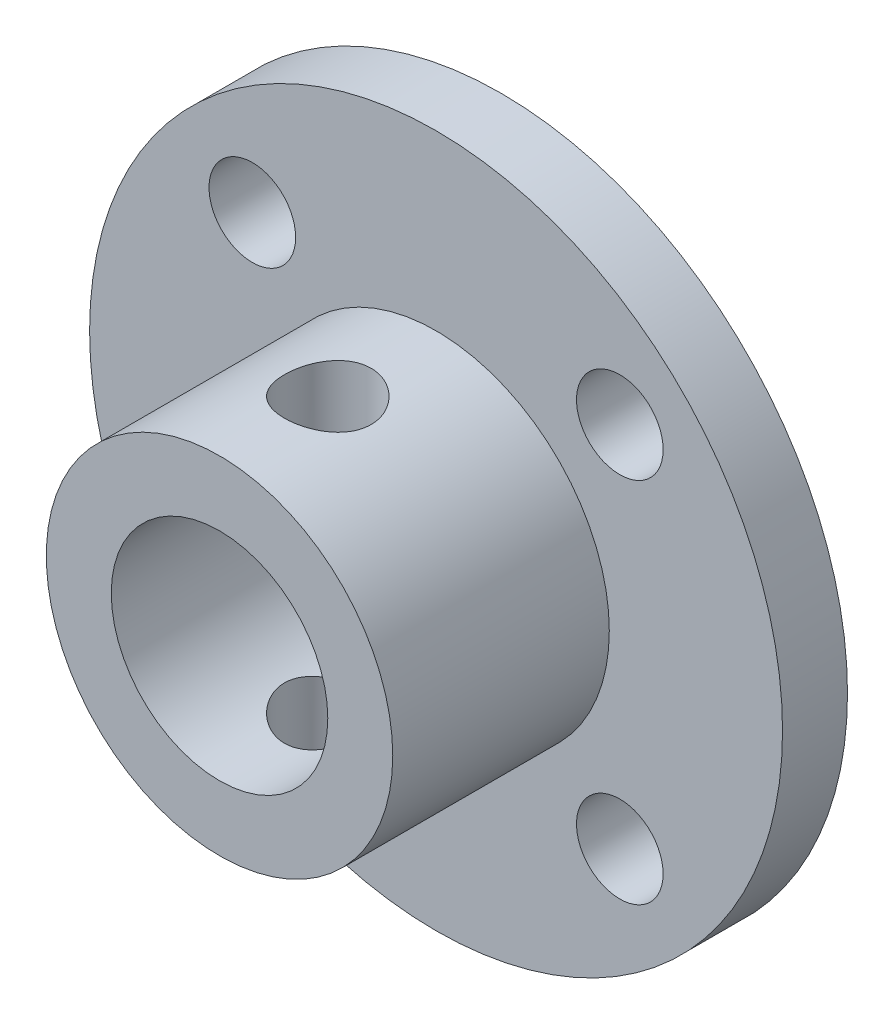
ISO-10303-21;
HEADER;
FILE_DESCRIPTION(('STEP AP214'),'2;1');
FILE_NAME('part.step','',(''),(''),'','','');
FILE_SCHEMA(('AUTOMOTIVE_DESIGN { 1 0 10303 214 1 1 1 1 }'));
ENDSEC;
DATA;
#1=APPLICATION_CONTEXT('core data for automotive mechanical design processes');
#2=APPLICATION_PROTOCOL_DEFINITION('international standard','automotive_design',2000,#1);
#3=PRODUCT_CONTEXT('',#1,'mechanical');
#4=PRODUCT('Part','Part','',(#3));
#5=PRODUCT_RELATED_PRODUCT_CATEGORY('part','',(#4));
#6=PRODUCT_DEFINITION_FORMATION('','',#4);
#7=PRODUCT_DEFINITION_CONTEXT('part definition',#1,'design');
#8=PRODUCT_DEFINITION('design','',#6,#7);
#9=PRODUCT_DEFINITION_SHAPE('','',#8);
#10=(LENGTH_UNIT() NAMED_UNIT(*) SI_UNIT(.MILLI.,.METRE.));
#11=(NAMED_UNIT(*) PLANE_ANGLE_UNIT() SI_UNIT($,.RADIAN.));
#12=(NAMED_UNIT(*) SI_UNIT($,.STERADIAN.) SOLID_ANGLE_UNIT());
#13=UNCERTAINTY_MEASURE_WITH_UNIT(LENGTH_MEASURE(1.E-05),#10,'distance_accuracy_value','');
#14=(GEOMETRIC_REPRESENTATION_CONTEXT(3) GLOBAL_UNCERTAINTY_ASSIGNED_CONTEXT((#13)) GLOBAL_UNIT_ASSIGNED_CONTEXT((#10,
#11,#12)) REPRESENTATION_CONTEXT('',''));
#15=CARTESIAN_POINT('',(0.,0.,0.));
#16=DIRECTION('',(0.,0.,1.));
#17=DIRECTION('',(1.,0.,0.));
#18=AXIS2_PLACEMENT_3D('',#15,#16,#17);
#19=CARTESIAN_POINT('',(0.,0.,3.));
#20=DIRECTION('',(0.,0.,-1.));
#21=DIRECTION('',(-1.,0.,0.));
#22=AXIS2_PLACEMENT_3D('',#19,#20,#21);
#23=CYLINDRICAL_SURFACE('',#22,5.);
#24=CARTESIAN_POINT('',(0.,-5.,6.));
#25=CARTESIAN_POINT('',(0.107493005442892,-4.99999271227084,6.00000985182372));
#26=CARTESIAN_POINT('',(0.215172564090674,-4.99649294306932,6.00871775208838));
#27=CARTESIAN_POINT('',(0.427496480417897,-4.98283453100641,6.04324770352124));
#28=CARTESIAN_POINT('',(0.532131777561249,-4.97265778698877,6.06911627908613));
#29=CARTESIAN_POINT('',(0.734953922727404,-4.94674209213118,6.13687607805883));
#30=CARTESIAN_POINT('',(0.83316066161696,-4.93102136364072,6.17871484621673));
#31=CARTESIAN_POINT('',(1.02107197032837,-4.89556610796078,6.27701917332655));
#32=CARTESIAN_POINT('',(1.11077947675099,-4.87583297458056,6.33347965491893));
#33=CARTESIAN_POINT('',(1.28350100757039,-4.83330886170418,6.46223549856094));
#34=CARTESIAN_POINT('',(1.36606227255021,-4.8104229692919,6.53510665624026));
#35=CARTESIAN_POINT('',(1.51817500478472,-4.76460576906194,6.69340000347678));
#36=CARTESIAN_POINT('',(1.58772010713353,-4.74167444453792,6.77882829721174));
#37=CARTESIAN_POINT('',(1.71487456729288,-4.69722791797136,6.96442807024227));
#38=CARTESIAN_POINT('',(1.77181498119547,-4.67582115964951,7.0650864860232));
#39=CARTESIAN_POINT('',(1.86775471903715,-4.63833647186792,7.27553639842004));
#40=CARTESIAN_POINT('',(1.90676256428584,-4.62225601244175,7.38532352784836));
#41=CARTESIAN_POINT('',(1.96389882339587,-4.59826357660818,7.6057123335921));
#42=CARTESIAN_POINT('',(1.98289396580565,-4.59001420355605,7.71605123557621));
#43=CARTESIAN_POINT('',(2.00217296164003,-4.58164004049144,7.93863499830727));
#44=CARTESIAN_POINT('',(2.00246601631322,-4.58151125522768,8.05087889462501));
#45=CARTESIAN_POINT('',(1.98498936750454,-4.58910500279994,8.26575667145804));
#46=CARTESIAN_POINT('',(1.96847531430514,-4.5962817503845,8.36851571440903));
#47=CARTESIAN_POINT('',(1.91994688029782,-4.61676187607836,8.56965955600671));
#48=CARTESIAN_POINT('',(1.88792979480463,-4.63006632321673,8.66804358811031));
#49=CARTESIAN_POINT('',(1.80869473255107,-4.6615948508853,8.86001783619604));
#50=CARTESIAN_POINT('',(1.76117986231532,-4.67991379280787,8.95346923905469));
#51=CARTESIAN_POINT('',(1.65250646073221,-4.7193811638989,9.13141581636157));
#52=CARTESIAN_POINT('',(1.59134280510084,-4.74053065456848,9.21590760940281));
#53=CARTESIAN_POINT('',(1.45155059945443,-4.7852673674227,9.380409728802));
#54=CARTESIAN_POINT('',(1.37193746297064,-4.80891664976151,9.45956872944602));
#55=CARTESIAN_POINT('',(1.20031442743019,-4.85459824958282,9.60368447800204));
#56=CARTESIAN_POINT('',(1.10830206533443,-4.87663024445324,9.66863839741029));
#57=CARTESIAN_POINT('',(0.912077652605844,-4.91714681264548,9.78361744741583));
#58=CARTESIAN_POINT('',(0.807660491346478,-4.93555270095414,9.83332228119705));
#59=CARTESIAN_POINT('',(0.591023765482883,-4.96614828328758,9.91416786107806));
#60=CARTESIAN_POINT('',(0.478808196849676,-4.97834113462382,9.94531803755741));
#61=CARTESIAN_POINT('',(0.256895887607822,-4.9945613950691,9.9864482954197));
#62=CARTESIAN_POINT('',(0.147443293985536,-4.99902945833514,9.99757245425356));
#63=CARTESIAN_POINT('',(-0.0718453098078155,-5.00068478510631,10.0017131005286));
#64=CARTESIAN_POINT('',(-0.181681213223922,-4.99787393582291,9.99473428154751));
#65=CARTESIAN_POINT('',(-0.393432739121986,-4.98557567063753,9.96370824744801));
#66=CARTESIAN_POINT('',(-0.495482491775473,-4.97639391345523,9.94044201964902));
#67=CARTESIAN_POINT('',(-0.694135428060779,-4.952594414055,9.87856429169019));
#68=CARTESIAN_POINT('',(-0.790737910224843,-4.9379759735653,9.83995082033132));
#69=CARTESIAN_POINT('',(-0.9790787858167,-4.90416594770811,9.74721506032005));
#70=CARTESIAN_POINT('',(-1.0705780227554,-4.88484815979803,9.69265452795685));
#71=CARTESIAN_POINT('',(-1.24344359124655,-4.84373364745524,9.57005967609436));
#72=CARTESIAN_POINT('',(-1.32480584076112,-4.8219359311027,9.50201995707739));
#73=CARTESIAN_POINT('',(-1.48072304302882,-4.77645117638111,9.34912998705038));
#74=CARTESIAN_POINT('',(-1.55447393380606,-4.75273441425052,9.26346645849379));
#75=CARTESIAN_POINT('',(-1.68675119741371,-4.70741672917132,9.08055991699064));
#76=CARTESIAN_POINT('',(-1.74527506133751,-4.68581615526511,8.98331499966005));
#77=CARTESIAN_POINT('',(-1.84580750193163,-4.64714299907708,8.7785383054059));
#78=CARTESIAN_POINT('',(-1.88765059453445,-4.63011630884788,8.67091600078769));
#79=CARTESIAN_POINT('',(-1.9522962197053,-4.60323673477931,8.44926634828485));
#80=CARTESIAN_POINT('',(-1.97511280526931,-4.59337855695998,8.33524379418758));
#81=CARTESIAN_POINT('',(-1.9997156172784,-4.58271759299926,8.11287209822546));
#82=CARTESIAN_POINT('',(-2.00289708230287,-4.58131421008171,8.00470516040665));
#83=CARTESIAN_POINT('',(-1.99180315927752,-4.58614836033098,7.78945514228671));
#84=CARTESIAN_POINT('',(-1.97752998791378,-4.59238492324793,7.68237192609742));
#85=CARTESIAN_POINT('',(-1.93307136615365,-4.6112664907902,7.47666781014496));
#86=CARTESIAN_POINT('',(-1.90353749357098,-4.62364831827449,7.377879725567));
#87=CARTESIAN_POINT('',(-1.83000544849101,-4.65324001232696,7.18662137038652));
#88=CARTESIAN_POINT('',(-1.78600328139381,-4.67045121206006,7.09415285310017));
#89=CARTESIAN_POINT('',(-1.68187276275973,-4.70898609604491,6.91239038072922));
#90=CARTESIAN_POINT('',(-1.62096533515949,-4.73048882313242,6.82358132986952));
#91=CARTESIAN_POINT('',(-1.4858921192715,-4.77463804372237,6.65700668279625));
#92=CARTESIAN_POINT('',(-1.41172233481812,-4.79728488048406,6.57924442787169));
#93=CARTESIAN_POINT('',(-1.24650550627246,-4.84293567087394,6.43179714673639));
#94=CARTESIAN_POINT('',(-1.15467600114614,-4.86586757962185,6.36296269310193));
#95=CARTESIAN_POINT('',(-0.959900320285779,-4.90800406713717,6.24166295737836));
#96=CARTESIAN_POINT('',(-0.856949004547238,-4.92720691092906,6.18920528784747));
#97=CARTESIAN_POINT('',(-0.644738062495204,-4.95939714815861,6.10337778480971));
#98=CARTESIAN_POINT('',(-0.535631618219697,-4.97249363055028,6.06967067643966));
#99=CARTESIAN_POINT('',(-0.312876546281222,-4.99144306209365,6.02136087904573));
#100=CARTESIAN_POINT('',(-0.199243525858914,-4.99731899495637,6.0066975632561));
#101=CARTESIAN_POINT('',(-0.0569122978909297,-4.99975899504136,6.00060461902173));
#102=CARTESIAN_POINT('',(-0.0284626887407579,-5.00000192969175,5.99999739137081));
#103=CARTESIAN_POINT('',(0.,-5.,6.));
#104=B_SPLINE_CURVE_WITH_KNOTS('',3,(#24,#25,#26,#27,#28,#29,#30,#31,#32,#33,#34,#35,#36,#37,
#38,#39,#40,#41,#42,#43,#44,#45,#46,#47,#48,#49,#50,#51,#52,#53,#54,#55,#56,#57,#58,#59,#60,#61,
#62,#63,#64,#65,#66,#67,#68,#69,#70,#71,#72,#73,#74,#75,#76,#77,#78,#79,#80,#81,#82,#83,#84,#85,
#86,#87,#88,#89,#90,#91,#92,#93,#94,#95,#96,#97,#98,#99,#100,#101,#102,#103),.UNSPECIFIED.,.T.,
.F.,(4,2,2,2,2,2,2,2,2,2,2,2,2,2,2,2,2,2,2,2,2,2,2,2,2,2,2,2,2,2,2,2,2,2,2,2,2,2,2,4),(0.,
0.322402987893071,0.645683636007934,0.967911457471581,1.29002753567984,1.62597381700397,
1.96208394934411,2.31315258819217,2.66405423118268,2.99904105308828,3.33386306340488,
3.64538328401372,3.95695787256047,4.27489126298816,4.59294421938183,4.93558349186557,
5.27829092839732,5.62776913162806,5.9770695611379,6.30569184528007,6.63422893570082,
6.94800455564365,7.26182048993796,7.58523513398262,7.90877959498969,8.25368474624413,
8.59864669043748,8.94695045140827,9.29499672645933,9.61799673392747,9.94095572563045,
10.2511431854877,10.5614163580516,10.8894546805669,11.2175920134839,11.5670042353384,
11.9165786364053,12.2596430101332,12.6016125240434,12.686980458968),.UNSPECIFIED.);
#105=CARTESIAN_POINT('',(0.,-5.,6.));
#106=VERTEX_POINT('',#105);
#107=EDGE_CURVE('E75',#106,#106,#104,.T.);
#108=ORIENTED_EDGE('',*,*,#107,.T.);
#109=EDGE_LOOP('',(#108));
#110=FACE_BOUND('',#109,.T.);
#111=CARTESIAN_POINT('',(0.,0.,0.));
#112=DIRECTION('',(0.,0.,1.));
#113=DIRECTION('',(1.,0.,0.));
#114=AXIS2_PLACEMENT_3D('',#111,#112,#113);
#115=CIRCLE('',#114,5.);
#116=CARTESIAN_POINT('',(5.,0.,0.));
#117=VERTEX_POINT('',#116);
#118=EDGE_CURVE('E51',#117,#117,#115,.T.);
#119=ORIENTED_EDGE('',*,*,#118,.F.);
#120=EDGE_LOOP('',(#119));
#121=FACE_BOUND('',#120,.T.);
#122=CARTESIAN_POINT('',(0.,0.,13.));
#123=DIRECTION('',(0.,0.,1.));
#124=DIRECTION('',(1.,0.,0.));
#125=AXIS2_PLACEMENT_3D('',#122,#123,#124);
#126=CIRCLE('',#125,5.);
#127=CARTESIAN_POINT('',(5.,0.,13.));
#128=VERTEX_POINT('',#127);
#129=EDGE_CURVE('E155',#128,#128,#126,.T.);
#130=ORIENTED_EDGE('',*,*,#129,.T.);
#131=EDGE_LOOP('',(#130));
#132=FACE_BOUND('',#131,.T.);
#133=CARTESIAN_POINT('',(0.,5.,6.));
#134=CARTESIAN_POINT('',(-0.10749300544289,4.99999271227084,6.00000985182372));
#135=CARTESIAN_POINT('',(-0.215172564090672,4.99649294306932,6.00871775208838));
#136=CARTESIAN_POINT('',(-0.427496480417895,4.98283453100641,6.04324770352124));
#137=CARTESIAN_POINT('',(-0.532131777561247,4.97265778698877,6.06911627908613));
#138=CARTESIAN_POINT('',(-0.734953922727402,4.94674209213118,6.13687607805883));
#139=CARTESIAN_POINT('',(-0.833160661616958,4.93102136364072,6.17871484621673));
#140=CARTESIAN_POINT('',(-1.02107197032837,4.89556610796078,6.27701917332655));
#141=CARTESIAN_POINT('',(-1.11077947675099,4.87583297458057,6.33347965491893));
#142=CARTESIAN_POINT('',(-1.28350100757039,4.83330886170419,6.46223549856094));
#143=CARTESIAN_POINT('',(-1.36606227255021,4.8104229692919,6.53510665624026));
#144=CARTESIAN_POINT('',(-1.51817500478472,4.76460576906194,6.69340000347678));
#145=CARTESIAN_POINT('',(-1.58772010713353,4.74167444453792,6.77882829721174));
#146=CARTESIAN_POINT('',(-1.71487456729288,4.69722791797136,6.96442807024227));
#147=CARTESIAN_POINT('',(-1.77181498119547,4.67582115964951,7.0650864860232));
#148=CARTESIAN_POINT('',(-1.86775471903715,4.63833647186792,7.27553639842004));
#149=CARTESIAN_POINT('',(-1.90676256428583,4.62225601244176,7.38532352784836));
#150=CARTESIAN_POINT('',(-1.96389882339587,4.59826357660818,7.6057123335921));
#151=CARTESIAN_POINT('',(-1.98289396580565,4.59001420355605,7.71605123557621));
#152=CARTESIAN_POINT('',(-2.00217296164003,4.58164004049144,7.93863499830727));
#153=CARTESIAN_POINT('',(-2.00246601631322,4.58151125522768,8.05087889462501));
#154=CARTESIAN_POINT('',(-1.98498936750454,4.58910500279994,8.26575667145804));
#155=CARTESIAN_POINT('',(-1.96847531430514,4.5962817503845,8.36851571440903));
#156=CARTESIAN_POINT('',(-1.91994688029782,4.61676187607836,8.56965955600671));
#157=CARTESIAN_POINT('',(-1.88792979480463,4.63006632321673,8.66804358811031));
#158=CARTESIAN_POINT('',(-1.80869473255107,4.6615948508853,8.86001783619604));
#159=CARTESIAN_POINT('',(-1.76117986231532,4.67991379280787,8.95346923905469));
#160=CARTESIAN_POINT('',(-1.65250646073221,4.7193811638989,9.13141581636157));
#161=CARTESIAN_POINT('',(-1.59134280510084,4.74053065456848,9.21590760940281));
#162=CARTESIAN_POINT('',(-1.45155059945443,4.7852673674227,9.380409728802));
#163=CARTESIAN_POINT('',(-1.37193746297063,4.80891664976151,9.45956872944602));
#164=CARTESIAN_POINT('',(-1.20031442743019,4.85459824958282,9.60368447800204));
#165=CARTESIAN_POINT('',(-1.10830206533443,4.87663024445324,9.66863839741029));
#166=CARTESIAN_POINT('',(-0.912077652605842,4.91714681264548,9.78361744741583));
#167=CARTESIAN_POINT('',(-0.807660491346477,4.93555270095414,9.83332228119705));
#168=CARTESIAN_POINT('',(-0.591023765482882,4.96614828328759,9.91416786107806));
#169=CARTESIAN_POINT('',(-0.478808196849674,4.97834113462382,9.94531803755741));
#170=CARTESIAN_POINT('',(-0.25689588760782,4.9945613950691,9.9864482954197));
#171=CARTESIAN_POINT('',(-0.147443293985535,4.99902945833514,9.99757245425356));
#172=CARTESIAN_POINT('',(0.0718453098078173,5.00068478510631,10.0017131005286));
#173=CARTESIAN_POINT('',(0.181681213223924,4.99787393582291,9.99473428154751));
#174=CARTESIAN_POINT('',(0.393432739121988,4.98557567063753,9.96370824744801));
#175=CARTESIAN_POINT('',(0.495482491775476,4.97639391345523,9.94044201964902));
#176=CARTESIAN_POINT('',(0.694135428060782,4.952594414055,9.87856429169019));
#177=CARTESIAN_POINT('',(0.790737910224846,4.9379759735653,9.83995082033132));
#178=CARTESIAN_POINT('',(0.979078785816703,4.90416594770811,9.74721506032005));
#179=CARTESIAN_POINT('',(1.07057802275541,4.88484815979803,9.69265452795685));
#180=CARTESIAN_POINT('',(1.24344359124656,4.84373364745524,9.57005967609436));
#181=CARTESIAN_POINT('',(1.32480584076113,4.8219359311027,9.50201995707739));
#182=CARTESIAN_POINT('',(1.48072304302882,4.77645117638112,9.34912998705038));
#183=CARTESIAN_POINT('',(1.55447393380606,4.75273441425052,9.26346645849379));
#184=CARTESIAN_POINT('',(1.68675119741371,4.70741672917132,9.08055991699064));
#185=CARTESIAN_POINT('',(1.74527506133751,4.6858161552651,8.98331499966005));
#186=CARTESIAN_POINT('',(1.84580750193163,4.64714299907708,8.7785383054059));
#187=CARTESIAN_POINT('',(1.88765059453445,4.63011630884787,8.67091600078769));
#188=CARTESIAN_POINT('',(1.9522962197053,4.60323673477931,8.44926634828485));
#189=CARTESIAN_POINT('',(1.97511280526932,4.59337855695998,8.33524379418758));
#190=CARTESIAN_POINT('',(1.9997156172784,4.58271759299926,8.11287209822546));
#191=CARTESIAN_POINT('',(2.00289708230287,4.58131421008171,8.00470516040665));
#192=CARTESIAN_POINT('',(1.99180315927753,4.58614836033098,7.78945514228671));
#193=CARTESIAN_POINT('',(1.97752998791378,4.59238492324793,7.68237192609742));
#194=CARTESIAN_POINT('',(1.93307136615365,4.6112664907902,7.47666781014496));
#195=CARTESIAN_POINT('',(1.90353749357098,4.62364831827449,7.377879725567));
#196=CARTESIAN_POINT('',(1.83000544849101,4.65324001232696,7.18662137038652));
#197=CARTESIAN_POINT('',(1.78600328139381,4.67045121206006,7.09415285310017));
#198=CARTESIAN_POINT('',(1.68187276275973,4.70898609604491,6.91239038072922));
#199=CARTESIAN_POINT('',(1.62096533515949,4.73048882313242,6.82358132986952));
#200=CARTESIAN_POINT('',(1.4858921192715,4.77463804372237,6.65700668279625));
#201=CARTESIAN_POINT('',(1.41172233481812,4.79728488048406,6.57924442787169));
#202=CARTESIAN_POINT('',(1.24650550627246,4.84293567087394,6.43179714673639));
#203=CARTESIAN_POINT('',(1.15467600114614,4.86586757962185,6.36296269310193));
#204=CARTESIAN_POINT('',(0.959900320285781,4.90800406713716,6.24166295737836));
#205=CARTESIAN_POINT('',(0.85694900454724,4.92720691092906,6.18920528784747));
#206=CARTESIAN_POINT('',(0.644738062495205,4.95939714815861,6.10337778480971));
#207=CARTESIAN_POINT('',(0.535631618219698,4.97249363055028,6.06967067643966));
#208=CARTESIAN_POINT('',(0.312876546281222,4.99144306209365,6.02136087904573));
#209=CARTESIAN_POINT('',(0.199243525858914,4.99731899495637,6.0066975632561));
#210=CARTESIAN_POINT('',(0.056912297890931,4.99975899504136,6.00060461902173));
#211=CARTESIAN_POINT('',(0.0284626887407595,5.00000192969175,5.99999739137081));
#212=CARTESIAN_POINT('',(0.,5.,6.));
#213=B_SPLINE_CURVE_WITH_KNOTS('',3,(#133,#134,#135,#136,#137,#138,#139,#140,#141,#142,#143,
#144,#145,#146,#147,#148,#149,#150,#151,#152,#153,#154,#155,#156,#157,#158,#159,#160,#161,#162,
#163,#164,#165,#166,#167,#168,#169,#170,#171,#172,#173,#174,#175,#176,#177,#178,#179,#180,#181,
#182,#183,#184,#185,#186,#187,#188,#189,#190,#191,#192,#193,#194,#195,#196,#197,#198,#199,#200,
#201,#202,#203,#204,#205,#206,#207,#208,#209,#210,#211,#212),.UNSPECIFIED.,.T.,.F.,(4,2,2,2,2,2,
2,2,2,2,2,2,2,2,2,2,2,2,2,2,2,2,2,2,2,2,2,2,2,2,2,2,2,2,2,2,2,2,2,4),(0.,0.322402987893071,
0.645683636007934,0.967911457471581,1.29002753567984,1.62597381700397,1.96208394934411,
2.31315258819217,2.66405423118268,2.99904105308829,3.33386306340488,3.64538328401372,
3.95695787256047,4.27489126298816,4.59294421938183,4.93558349186557,5.27829092839733,
5.62776913162806,5.9770695611379,6.30569184528007,6.63422893570082,6.94800455564366,
7.26182048993797,7.58523513398263,7.90877959498969,8.25368474624413,8.59864669043748,
8.94695045140827,9.29499672645933,9.61799673392748,9.94095572563045,10.2511431854877,
10.5614163580516,10.8894546805669,11.2175920134839,11.5670042353384,11.9165786364053,
12.2596430101332,12.6016125240434,12.686980458968),.UNSPECIFIED.);
#214=CARTESIAN_POINT('',(0.,5.,6.));
#215=VERTEX_POINT('',#214);
#216=EDGE_CURVE('E81',#215,#215,#213,.T.);
#217=ORIENTED_EDGE('',*,*,#216,.T.);
#218=EDGE_LOOP('',(#217));
#219=FACE_BOUND('',#218,.T.);
#220=ADVANCED_FACE('F33',(#110,#121,#132,#219),#23,.F.);
#221=CARTESIAN_POINT('',(0.,0.,13.));
#222=DIRECTION('',(0.,0.,-1.));
#223=DIRECTION('',(-1.,0.,0.));
#224=AXIS2_PLACEMENT_3D('',#221,#222,#223);
#225=CYLINDRICAL_SURFACE('',#224,8.);
#226=CARTESIAN_POINT('',(0.,0.,13.));
#227=DIRECTION('',(0.,0.,1.));
#228=DIRECTION('',(1.,0.,0.));
#229=AXIS2_PLACEMENT_3D('',#226,#227,#228);
#230=CIRCLE('',#229,8.);
#231=CARTESIAN_POINT('',(8.,0.,13.));
#232=VERTEX_POINT('',#231);
#233=EDGE_CURVE('E126',#232,#232,#230,.T.);
#234=ORIENTED_EDGE('',*,*,#233,.F.);
#235=EDGE_LOOP('',(#234));
#236=FACE_BOUND('',#235,.T.);
#237=CARTESIAN_POINT('',(0.,0.,3.));
#238=DIRECTION('',(0.,0.,1.));
#239=DIRECTION('',(1.,0.,0.));
#240=AXIS2_PLACEMENT_3D('',#237,#238,#239);
#241=CIRCLE('',#240,8.);
#242=CARTESIAN_POINT('',(8.,0.,3.));
#243=VERTEX_POINT('',#242);
#244=EDGE_CURVE('E131',#243,#243,#241,.T.);
#245=ORIENTED_EDGE('',*,*,#244,.T.);
#246=EDGE_LOOP('',(#245));
#247=FACE_BOUND('',#246,.T.);
#248=CARTESIAN_POINT('',(0.,-8.,6.));
#249=CARTESIAN_POINT('',(0.110501451559642,-7.9999981315735,6.00000310098421));
#250=CARTESIAN_POINT('',(0.221037543774352,-7.99768770842435,6.00918873436505));
#251=CARTESIAN_POINT('',(0.438941765027378,-7.98869485106526,6.04563353507601));
#252=CARTESIAN_POINT('',(0.54630806249432,-7.98200993893301,6.07290294605047));
#253=CARTESIAN_POINT('',(0.754694496243436,-7.96500835109376,6.14458567128278));
#254=CARTESIAN_POINT('',(0.855722084573337,-7.95469603789411,6.18897839828703));
#255=CARTESIAN_POINT('',(1.04889617587257,-7.93153791743495,6.29357518672646));
#256=CARTESIAN_POINT('',(1.14104237913168,-7.91869202472209,6.35377978149196));
#257=CARTESIAN_POINT('',(1.31573590306789,-7.89156551455591,6.48960105287224));
#258=CARTESIAN_POINT('',(1.39807425341474,-7.87726276197502,6.56548209994541));
#259=CARTESIAN_POINT('',(1.54899856960443,-7.84898160157248,6.72993627321205));
#260=CARTESIAN_POINT('',(1.61758298259892,-7.83500323053157,6.81851083059591));
#261=CARTESIAN_POINT('',(1.74003539039863,-7.80873034264225,7.00746030231599));
#262=CARTESIAN_POINT('',(1.79366962123352,-7.79646392619748,7.10799097441164));
#263=CARTESIAN_POINT('',(1.88319587806766,-7.77532659757355,7.31699788221338));
#264=CARTESIAN_POINT('',(1.91909074058686,-7.76645514259225,7.42547284444269));
#265=CARTESIAN_POINT('',(1.97140644907302,-7.7533396892843,7.64499133093555));
#266=CARTESIAN_POINT('',(1.98820302444274,-7.74900654662681,7.75593986138399));
#267=CARTESIAN_POINT('',(2.00301570008855,-7.74519149946122,7.97915809199913));
#268=CARTESIAN_POINT('',(2.00103485575748,-7.74570880570571,8.09142757425618));
#269=CARTESIAN_POINT('',(1.97864869951961,-7.75145607355756,8.3112210769938));
#270=CARTESIAN_POINT('',(1.95869112025418,-7.75657150676391,8.41879416195377));
#271=CARTESIAN_POINT('',(1.90163224920399,-7.77075612894758,8.62901473454808));
#272=CARTESIAN_POINT('',(1.86452973609252,-7.77982559958985,8.73166187070523));
#273=CARTESIAN_POINT('',(1.77385263724958,-7.80100151874212,8.93031735500284));
#274=CARTESIAN_POINT('',(1.72011555631056,-7.81313769959755,9.02624822905276));
#275=CARTESIAN_POINT('',(1.59780836801993,-7.83906281127988,9.20789161300909));
#276=CARTESIAN_POINT('',(1.52923566507845,-7.85285203112837,9.29360233075634));
#277=CARTESIAN_POINT('',(1.37688456624163,-7.88101174053188,9.4549381542592));
#278=CARTESIAN_POINT('',(1.29272834422115,-7.89538759304001,9.53020598674847));
#279=CARTESIAN_POINT('',(1.11281589000493,-7.92274620771675,9.6656283232852));
#280=CARTESIAN_POINT('',(1.01705930361059,-7.93572892732543,9.72578236568475));
#281=CARTESIAN_POINT('',(0.816154518241857,-7.9589030945892,9.82940078163251));
#282=CARTESIAN_POINT('',(0.710975190944832,-7.96908480170303,9.87280712033924));
#283=CARTESIAN_POINT('',(0.494501344190511,-7.98543889321888,9.94122307427943));
#284=CARTESIAN_POINT('',(0.383207998867314,-7.99161204452374,9.96623620855752));
#285=CARTESIAN_POINT('',(0.160719960520037,-7.999139990285,9.99661008741178));
#286=CARTESIAN_POINT('',(0.049595626650947,-8.00061404677705,10.0024573681004));
#287=CARTESIAN_POINT('',(-0.172043833068677,-7.99891739752601,9.99566799725935));
#288=CARTESIAN_POINT('',(-0.282559012859459,-7.99574710989128,9.98303300960116));
#289=CARTESIAN_POINT('',(-0.498152358368655,-7.98519441503143,9.94003878881149));
#290=CARTESIAN_POINT('',(-0.603286825291672,-7.97787512247748,9.90994498203068));
#291=CARTESIAN_POINT('',(-0.807009723270014,-7.95984942178845,9.83319055462874));
#292=CARTESIAN_POINT('',(-0.905597492043511,-7.94914267159856,9.78652826091577));
#293=CARTESIAN_POINT('',(-1.0953641792398,-7.92524410568414,9.6770184948337));
#294=CARTESIAN_POINT('',(-1.18638058911444,-7.91201156489243,9.61389851680432));
#295=CARTESIAN_POINT('',(-1.35670215152433,-7.88459345583226,9.47361345493737));
#296=CARTESIAN_POINT('',(-1.43600527863068,-7.87040772335606,9.39644594717746));
#297=CARTESIAN_POINT('',(-1.58265409076364,-7.84225275947695,9.22799738554071));
#298=CARTESIAN_POINT('',(-1.64965849016271,-7.82829738916375,9.13641639599677));
#299=CARTESIAN_POINT('',(-1.7673476786836,-7.80257171169652,8.94302315404571));
#300=CARTESIAN_POINT('',(-1.81803319221058,-7.79080130756035,8.84121135605366));
#301=CARTESIAN_POINT('',(-1.90126856081239,-7.77090792979554,8.6307923701159));
#302=CARTESIAN_POINT('',(-1.93392586220542,-7.76276340389207,8.52222982887465));
#303=CARTESIAN_POINT('',(-1.98046087993837,-7.75102325453578,8.30092048281452));
#304=CARTESIAN_POINT('',(-1.99434270330488,-7.74742663626581,8.18817459862335));
#305=CARTESIAN_POINT('',(-2.00271812044532,-7.74526534938609,7.96517196819306));
#306=CARTESIAN_POINT('',(-1.99775719704016,-7.74655910304352,7.85493675316703));
#307=CARTESIAN_POINT('',(-1.96983637108382,-7.7537054534379,7.63692814844269));
#308=CARTESIAN_POINT('',(-1.94687683024902,-7.75955795855809,7.52915470931513));
#309=CARTESIAN_POINT('',(-1.88390842592372,-7.77508347576963,7.31972205457946));
#310=CARTESIAN_POINT('',(-1.84400187290717,-7.78473353648412,7.21803025967972));
#311=CARTESIAN_POINT('',(-1.74835321814009,-7.80677007633105,7.02271282304842));
#312=CARTESIAN_POINT('',(-1.69260892004558,-7.81915693494364,6.92908830241745));
#313=CARTESIAN_POINT('',(-1.56515699818285,-7.8456751235135,6.74992716133064));
#314=CARTESIAN_POINT('',(-1.49307088388301,-7.85984353109009,6.66466523543472));
#315=CARTESIAN_POINT('',(-1.33571916158631,-7.88810702995048,6.50727060693946));
#316=CARTESIAN_POINT('',(-1.25045042834819,-7.90220210302746,6.43514102651604));
#317=CARTESIAN_POINT('',(-1.06729011560345,-7.92903540863551,6.30478492191386));
#318=CARTESIAN_POINT('',(-0.969197896421848,-7.94174444487824,6.24683384843789));
#319=CARTESIAN_POINT('',(-0.764354746013968,-7.96406566633491,6.14833671607929));
#320=CARTESIAN_POINT('',(-0.657610084582319,-7.97368006933042,6.10777818580195));
#321=CARTESIAN_POINT('',(-0.459213670991295,-7.98730746087389,6.05123755956046));
#322=CARTESIAN_POINT('',(-0.368506894544091,-7.9920344673692,6.03206500926209));
#323=CARTESIAN_POINT('',(-0.185208095381711,-7.99838140309264,6.00644540850408));
#324=CARTESIAN_POINT('',(-0.0926162149901543,-8.00000156601192,5.99999740092627));
#325=CARTESIAN_POINT('',(0.,-8.,6.));
#326=B_SPLINE_CURVE_WITH_KNOTS('',3,(#248,#249,#250,#251,#252,#253,#254,#255,#256,#257,#258,
#259,#260,#261,#262,#263,#264,#265,#266,#267,#268,#269,#270,#271,#272,#273,#274,#275,#276,#277,
#278,#279,#280,#281,#282,#283,#284,#285,#286,#287,#288,#289,#290,#291,#292,#293,#294,#295,#296,
#297,#298,#299,#300,#301,#302,#303,#304,#305,#306,#307,#308,#309,#310,#311,#312,#313,#314,#315,
#316,#317,#318,#319,#320,#321,#322,#323,#324,#325),.UNSPECIFIED.,.T.,.F.,(4,2,2,2,2,2,2,2,2,2,2,
2,2,2,2,2,2,2,2,2,2,2,2,2,2,2,2,2,2,2,2,2,2,2,2,2,2,2,4),(0.,0.33116494996252,0.662517650351866,
0.99347320304814,1.32443992022577,1.66152580582852,1.99864972773416,2.34078196727742,
2.68285948225824,3.01808393468093,3.3532538415469,3.68029996013785,4.00736937959145,
4.337740371696,4.66816921119311,5.00802001296453,5.34788119415424,5.6889097201658,
6.02987298255951,6.36211078603463,6.69431868154751,7.02160366023144,7.34892169767481,
7.68204783424897,8.01523150681786,8.35659345610395,8.69794025003771,9.03723006156476,
9.37644564340971,9.70591707202577,10.0353818794581,10.3628853408369,10.6904342418696,
11.0265276855097,11.3627009303165,11.7049624733721,12.0469781843289,12.3245632392729,
12.6021274139515),.UNSPECIFIED.);
#327=CARTESIAN_POINT('',(0.,-8.,6.));
#328=VERTEX_POINT('',#327);
#329=EDGE_CURVE('E55',#328,#328,#326,.T.);
#330=ORIENTED_EDGE('',*,*,#329,.F.);
#331=EDGE_LOOP('',(#330));
#332=FACE_BOUND('',#331,.T.);
#333=CARTESIAN_POINT('',(0.,8.,6.));
#334=CARTESIAN_POINT('',(-0.11050145155964,7.9999981315735,6.00000310098421));
#335=CARTESIAN_POINT('',(-0.22103754377435,7.99768770842435,6.00918873436505));
#336=CARTESIAN_POINT('',(-0.438941765027376,7.98869485106526,6.04563353507601));
#337=CARTESIAN_POINT('',(-0.546308062494318,7.98200993893301,6.07290294605047));
#338=CARTESIAN_POINT('',(-0.754694496243434,7.96500835109376,6.14458567128278));
#339=CARTESIAN_POINT('',(-0.855722084573335,7.95469603789411,6.18897839828703));
#340=CARTESIAN_POINT('',(-1.04889617587257,7.93153791743495,6.29357518672646));
#341=CARTESIAN_POINT('',(-1.14104237913168,7.91869202472209,6.35377978149196));
#342=CARTESIAN_POINT('',(-1.31573590306789,7.89156551455591,6.48960105287224));
#343=CARTESIAN_POINT('',(-1.39807425341474,7.87726276197502,6.56548209994541));
#344=CARTESIAN_POINT('',(-1.54899856960442,7.84898160157248,6.72993627321205));
#345=CARTESIAN_POINT('',(-1.61758298259892,7.83500323053157,6.81851083059591));
#346=CARTESIAN_POINT('',(-1.74003539039863,7.80873034264225,7.00746030231599));
#347=CARTESIAN_POINT('',(-1.79366962123352,7.79646392619748,7.10799097441164));
#348=CARTESIAN_POINT('',(-1.88319587806766,7.77532659757355,7.31699788221338));
#349=CARTESIAN_POINT('',(-1.91909074058685,7.76645514259225,7.42547284444269));
#350=CARTESIAN_POINT('',(-1.97140644907302,7.7533396892843,7.64499133093555));
#351=CARTESIAN_POINT('',(-1.98820302444274,7.74900654662681,7.75593986138399));
#352=CARTESIAN_POINT('',(-2.00301570008854,7.74519149946122,7.97915809199913));
#353=CARTESIAN_POINT('',(-2.00103485575748,7.74570880570571,8.09142757425618));
#354=CARTESIAN_POINT('',(-1.97864869951961,7.75145607355756,8.3112210769938));
#355=CARTESIAN_POINT('',(-1.95869112025418,7.75657150676391,8.41879416195377));
#356=CARTESIAN_POINT('',(-1.90163224920399,7.77075612894758,8.62901473454808));
#357=CARTESIAN_POINT('',(-1.86452973609252,7.77982559958985,8.73166187070523));
#358=CARTESIAN_POINT('',(-1.77385263724958,7.80100151874212,8.93031735500284));
#359=CARTESIAN_POINT('',(-1.72011555631056,7.81313769959755,9.02624822905276));
#360=CARTESIAN_POINT('',(-1.59780836801993,7.83906281127988,9.20789161300909));
#361=CARTESIAN_POINT('',(-1.52923566507845,7.85285203112837,9.29360233075633));
#362=CARTESIAN_POINT('',(-1.37688456624163,7.88101174053188,9.4549381542592));
#363=CARTESIAN_POINT('',(-1.29272834422115,7.89538759304001,9.53020598674847));
#364=CARTESIAN_POINT('',(-1.11281589000493,7.92274620771675,9.6656283232852));
#365=CARTESIAN_POINT('',(-1.01705930361059,7.93572892732543,9.72578236568475));
#366=CARTESIAN_POINT('',(-0.816154518241855,7.9589030945892,9.82940078163251));
#367=CARTESIAN_POINT('',(-0.710975190944831,7.96908480170303,9.87280712033924));
#368=CARTESIAN_POINT('',(-0.49450134419051,7.98543889321888,9.94122307427943));
#369=CARTESIAN_POINT('',(-0.383207998867312,7.99161204452374,9.96623620855752));
#370=CARTESIAN_POINT('',(-0.160719960520035,7.999139990285,9.99661008741178));
#371=CARTESIAN_POINT('',(-0.0495956266509454,8.00061404677705,10.0024573681004));
#372=CARTESIAN_POINT('',(0.172043833068678,7.99891739752601,9.99566799725935));
#373=CARTESIAN_POINT('',(0.282559012859461,7.99574710989128,9.98303300960116));
#374=CARTESIAN_POINT('',(0.498152358368657,7.98519441503143,9.94003878881149));
#375=CARTESIAN_POINT('',(0.603286825291674,7.97787512247748,9.90994498203068));
#376=CARTESIAN_POINT('',(0.807009723270016,7.95984942178845,9.83319055462874));
#377=CARTESIAN_POINT('',(0.905597492043514,7.94914267159856,9.78652826091577));
#378=CARTESIAN_POINT('',(1.0953641792398,7.92524410568414,9.6770184948337));
#379=CARTESIAN_POINT('',(1.18638058911444,7.91201156489243,9.61389851680432));
#380=CARTESIAN_POINT('',(1.35670215152433,7.88459345583226,9.47361345493737));
#381=CARTESIAN_POINT('',(1.43600527863068,7.87040772335606,9.39644594717746));
#382=CARTESIAN_POINT('',(1.58265409076364,7.84225275947695,9.22799738554071));
#383=CARTESIAN_POINT('',(1.64965849016271,7.82829738916375,9.13641639599677));
#384=CARTESIAN_POINT('',(1.7673476786836,7.80257171169652,8.94302315404571));
#385=CARTESIAN_POINT('',(1.81803319221058,7.79080130756035,8.84121135605366));
#386=CARTESIAN_POINT('',(1.90126856081239,7.77090792979553,8.6307923701159));
#387=CARTESIAN_POINT('',(1.93392586220542,7.76276340389207,8.52222982887465));
#388=CARTESIAN_POINT('',(1.98046087993837,7.75102325453578,8.30092048281452));
#389=CARTESIAN_POINT('',(1.99434270330488,7.74742663626581,8.18817459862335));
#390=CARTESIAN_POINT('',(2.00271812044533,7.74526534938609,7.96517196819306));
#391=CARTESIAN_POINT('',(1.99775719704016,7.74655910304351,7.85493675316703));
#392=CARTESIAN_POINT('',(1.96983637108382,7.7537054534379,7.63692814844269));
#393=CARTESIAN_POINT('',(1.94687683024903,7.75955795855809,7.52915470931513));
#394=CARTESIAN_POINT('',(1.88390842592373,7.77508347576963,7.31972205457946));
#395=CARTESIAN_POINT('',(1.84400187290717,7.78473353648412,7.21803025967972));
#396=CARTESIAN_POINT('',(1.74835321814009,7.80677007633105,7.02271282304841));
#397=CARTESIAN_POINT('',(1.69260892004559,7.81915693494364,6.92908830241745));
#398=CARTESIAN_POINT('',(1.56515699818285,7.84567512351349,6.74992716133064));
#399=CARTESIAN_POINT('',(1.49307088388301,7.85984353109009,6.66466523543472));
#400=CARTESIAN_POINT('',(1.33571916158632,7.88810702995047,6.50727060693946));
#401=CARTESIAN_POINT('',(1.2504504283482,7.90220210302746,6.43514102651604));
#402=CARTESIAN_POINT('',(1.06729011560345,7.9290354086355,6.30478492191386));
#403=CARTESIAN_POINT('',(0.96919789642185,7.94174444487824,6.24683384843789));
#404=CARTESIAN_POINT('',(0.764354746013969,7.96406566633491,6.14833671607929));
#405=CARTESIAN_POINT('',(0.657610084582321,7.97368006933042,6.10777818580195));
#406=CARTESIAN_POINT('',(0.459213670991297,7.98730746087389,6.05123755956046));
#407=CARTESIAN_POINT('',(0.368506894544092,7.9920344673692,6.03206500926209));
#408=CARTESIAN_POINT('',(0.185208095381711,7.99838140309264,6.00644540850408));
#409=CARTESIAN_POINT('',(0.0926162149901558,8.00000156601192,5.99999740092627));
#410=CARTESIAN_POINT('',(0.,8.,6.));
#411=B_SPLINE_CURVE_WITH_KNOTS('',3,(#333,#334,#335,#336,#337,#338,#339,#340,#341,#342,#343,
#344,#345,#346,#347,#348,#349,#350,#351,#352,#353,#354,#355,#356,#357,#358,#359,#360,#361,#362,
#363,#364,#365,#366,#367,#368,#369,#370,#371,#372,#373,#374,#375,#376,#377,#378,#379,#380,#381,
#382,#383,#384,#385,#386,#387,#388,#389,#390,#391,#392,#393,#394,#395,#396,#397,#398,#399,#400,
#401,#402,#403,#404,#405,#406,#407,#408,#409,#410),.UNSPECIFIED.,.T.,.F.,(4,2,2,2,2,2,2,2,2,2,2,
2,2,2,2,2,2,2,2,2,2,2,2,2,2,2,2,2,2,2,2,2,2,2,2,2,2,2,4),(0.,0.331164949962519,
0.662517650351866,0.99347320304814,1.32443992022577,1.66152580582852,1.99864972773416,
2.34078196727742,2.68285948225824,3.01808393468093,3.3532538415469,3.68029996013785,
4.00736937959145,4.337740371696,4.66816921119311,5.00802001296453,5.34788119415424,
5.68890972016579,6.02987298255951,6.36211078603462,6.69431868154751,7.02160366023144,
7.34892169767481,7.68204783424897,8.01523150681786,8.35659345610395,8.69794025003771,
9.03723006156476,9.37644564340971,9.70591707202577,10.0353818794581,10.3628853408369,
10.6904342418696,11.0265276855097,11.3627009303165,11.7049624733721,12.0469781843289,
12.3245632392729,12.6021274139515),.UNSPECIFIED.);
#412=CARTESIAN_POINT('',(0.,8.,6.));
#413=VERTEX_POINT('',#412);
#414=EDGE_CURVE('E37',#413,#413,#411,.T.);
#415=ORIENTED_EDGE('',*,*,#414,.F.);
#416=EDGE_LOOP('',(#415));
#417=FACE_BOUND('',#416,.T.);
#418=ADVANCED_FACE('F60',(#236,#247,#332,#417),#225,.T.);
#419=CARTESIAN_POINT('',(0.,0.,3.));
#420=DIRECTION('',(0.,0.,1.));
#421=DIRECTION('',(1.,0.,0.));
#422=AXIS2_PLACEMENT_3D('',#419,#420,#421);
#423=PLANE('',#422);
#424=CARTESIAN_POINT('',(8.48528137423864,8.48528137423849,3.));
#425=DIRECTION('',(0.,0.,1.));
#426=DIRECTION('',(1.,0.,0.));
#427=AXIS2_PLACEMENT_3D('',#424,#425,#426);
#428=CIRCLE('',#427,2.);
#429=CARTESIAN_POINT('',(10.4852813742386,8.48528137423849,3.));
#430=VERTEX_POINT('',#429);
#431=EDGE_CURVE('E125',#430,#430,#428,.T.);
#432=ORIENTED_EDGE('',*,*,#431,.F.);
#433=EDGE_LOOP('',(#432));
#434=FACE_BOUND('',#433,.T.);
#435=CARTESIAN_POINT('',(-8.48528137423859,-8.48528137423856,3.));
#436=DIRECTION('',(0.,0.,1.));
#437=DIRECTION('',(1.,0.,0.));
#438=AXIS2_PLACEMENT_3D('',#435,#436,#437);
#439=CIRCLE('',#438,2.);
#440=CARTESIAN_POINT('',(-6.48528137423859,-8.48528137423856,3.));
#441=VERTEX_POINT('',#440);
#442=EDGE_CURVE('E139',#441,#441,#439,.T.);
#443=ORIENTED_EDGE('',*,*,#442,.F.);
#444=EDGE_LOOP('',(#443));
#445=FACE_BOUND('',#444,.T.);
#446=CARTESIAN_POINT('',(0.,0.,3.));
#447=DIRECTION('',(0.,0.,1.));
#448=DIRECTION('',(1.,0.,0.));
#449=AXIS2_PLACEMENT_3D('',#446,#447,#448);
#450=CIRCLE('',#449,16.);
#451=CARTESIAN_POINT('',(16.,0.,3.));
#452=VERTEX_POINT('',#451);
#453=EDGE_CURVE('E10',#452,#452,#450,.T.);
#454=ORIENTED_EDGE('',*,*,#453,.T.);
#455=EDGE_LOOP('',(#454));
#456=FACE_BOUND('',#455,.T.);
#457=CARTESIAN_POINT('',(8.48528137423859,-8.48528137423856,3.));
#458=DIRECTION('',(0.,0.,1.));
#459=DIRECTION('',(1.,0.,0.));
#460=AXIS2_PLACEMENT_3D('',#457,#458,#459);
#461=CIRCLE('',#460,2.);
#462=CARTESIAN_POINT('',(10.4852813742386,-8.48528137423856,3.));
#463=VERTEX_POINT('',#462);
#464=EDGE_CURVE('E143',#463,#463,#461,.T.);
#465=ORIENTED_EDGE('',*,*,#464,.F.);
#466=EDGE_LOOP('',(#465));
#467=FACE_BOUND('',#466,.T.);
#468=CARTESIAN_POINT('',(-8.48528137423853,8.48528137423861,3.));
#469=DIRECTION('',(0.,0.,1.));
#470=DIRECTION('',(1.,0.,0.));
#471=AXIS2_PLACEMENT_3D('',#468,#469,#470);
#472=CIRCLE('',#471,2.);
#473=CARTESIAN_POINT('',(-6.48528137423853,8.48528137423861,3.));
#474=VERTEX_POINT('',#473);
#475=EDGE_CURVE('E135',#474,#474,#472,.T.);
#476=ORIENTED_EDGE('',*,*,#475,.F.);
#477=EDGE_LOOP('',(#476));
#478=FACE_BOUND('',#477,.T.);
#479=ORIENTED_EDGE('',*,*,#244,.F.);
#480=EDGE_LOOP('',(#479));
#481=FACE_BOUND('',#480,.T.);
#482=ADVANCED_FACE('F93',(#434,#445,#456,#467,#478,#481),#423,.T.);
#483=CARTESIAN_POINT('',(0.,0.,0.));
#484=DIRECTION('',(0.,0.,1.));
#485=DIRECTION('',(1.,0.,0.));
#486=AXIS2_PLACEMENT_3D('',#483,#484,#485);
#487=PLANE('',#486);
#488=CARTESIAN_POINT('',(0.,0.,0.));
#489=DIRECTION('',(0.,0.,1.));
#490=DIRECTION('',(1.,0.,0.));
#491=AXIS2_PLACEMENT_3D('',#488,#489,#490);
#492=CIRCLE('',#491,16.);
#493=CARTESIAN_POINT('',(16.,0.,0.));
#494=VERTEX_POINT('',#493);
#495=EDGE_CURVE('E46',#494,#494,#492,.T.);
#496=ORIENTED_EDGE('',*,*,#495,.F.);
#497=EDGE_LOOP('',(#496));
#498=FACE_BOUND('',#497,.T.);
#499=ORIENTED_EDGE('',*,*,#118,.T.);
#500=EDGE_LOOP('',(#499));
#501=FACE_BOUND('',#500,.T.);
#502=CARTESIAN_POINT('',(8.48528137423859,-8.48528137423856,0.));
#503=DIRECTION('',(0.,0.,1.));
#504=DIRECTION('',(1.,0.,0.));
#505=AXIS2_PLACEMENT_3D('',#502,#503,#504);
#506=CIRCLE('',#505,2.);
#507=CARTESIAN_POINT('',(10.4852813742386,-8.48528137423856,0.));
#508=VERTEX_POINT('',#507);
#509=EDGE_CURVE('E112',#508,#508,#506,.T.);
#510=ORIENTED_EDGE('',*,*,#509,.T.);
#511=EDGE_LOOP('',(#510));
#512=FACE_BOUND('',#511,.T.);
#513=CARTESIAN_POINT('',(-8.48528137423859,-8.48528137423856,0.));
#514=DIRECTION('',(0.,0.,1.));
#515=DIRECTION('',(1.,0.,0.));
#516=AXIS2_PLACEMENT_3D('',#513,#514,#515);
#517=CIRCLE('',#516,2.);
#518=CARTESIAN_POINT('',(-6.48528137423859,-8.48528137423856,0.));
#519=VERTEX_POINT('',#518);
#520=EDGE_CURVE('E116',#519,#519,#517,.T.);
#521=ORIENTED_EDGE('',*,*,#520,.T.);
#522=EDGE_LOOP('',(#521));
#523=FACE_BOUND('',#522,.T.);
#524=CARTESIAN_POINT('',(-8.48528137423853,8.48528137423861,0.));
#525=DIRECTION('',(0.,0.,1.));
#526=DIRECTION('',(1.,0.,0.));
#527=AXIS2_PLACEMENT_3D('',#524,#525,#526);
#528=CIRCLE('',#527,2.);
#529=CARTESIAN_POINT('',(-6.48528137423853,8.48528137423861,0.));
#530=VERTEX_POINT('',#529);
#531=EDGE_CURVE('E120',#530,#530,#528,.T.);
#532=ORIENTED_EDGE('',*,*,#531,.T.);
#533=EDGE_LOOP('',(#532));
#534=FACE_BOUND('',#533,.T.);
#535=CARTESIAN_POINT('',(8.48528137423864,8.48528137423849,0.));
#536=DIRECTION('',(0.,0.,1.));
#537=DIRECTION('',(1.,0.,0.));
#538=AXIS2_PLACEMENT_3D('',#535,#536,#537);
#539=CIRCLE('',#538,2.);
#540=CARTESIAN_POINT('',(10.4852813742386,8.48528137423849,0.));
#541=VERTEX_POINT('',#540);
#542=EDGE_CURVE('E123',#541,#541,#539,.T.);
#543=ORIENTED_EDGE('',*,*,#542,.T.);
#544=EDGE_LOOP('',(#543));
#545=FACE_BOUND('',#544,.T.);
#546=ADVANCED_FACE('F96',(#498,#501,#512,#523,#534,#545),#487,.F.);
#547=CARTESIAN_POINT('',(0.,0.,3.));
#548=DIRECTION('',(0.,0.,-1.));
#549=DIRECTION('',(-1.,0.,0.));
#550=AXIS2_PLACEMENT_3D('',#547,#548,#549);
#551=CYLINDRICAL_SURFACE('',#550,16.);
#552=ORIENTED_EDGE('',*,*,#453,.F.);
#553=EDGE_LOOP('',(#552));
#554=FACE_BOUND('',#553,.T.);
#555=ORIENTED_EDGE('',*,*,#495,.T.);
#556=EDGE_LOOP('',(#555));
#557=FACE_BOUND('',#556,.T.);
#558=ADVANCED_FACE('F35',(#554,#557),#551,.T.);
#559=CARTESIAN_POINT('',(8.48528137423859,-8.48528137423856,3.));
#560=DIRECTION('',(0.,0.,-1.));
#561=DIRECTION('',(-1.,0.,0.));
#562=AXIS2_PLACEMENT_3D('',#559,#560,#561);
#563=CYLINDRICAL_SURFACE('',#562,2.);
#564=ORIENTED_EDGE('',*,*,#464,.T.);
#565=EDGE_LOOP('',(#564));
#566=FACE_BOUND('',#565,.T.);
#567=ORIENTED_EDGE('',*,*,#509,.F.);
#568=EDGE_LOOP('',(#567));
#569=FACE_BOUND('',#568,.T.);
#570=ADVANCED_FACE('F91',(#566,#569),#563,.F.);
#571=CARTESIAN_POINT('',(-8.48528137423859,-8.48528137423856,3.));
#572=DIRECTION('',(0.,0.,-1.));
#573=DIRECTION('',(-1.,0.,0.));
#574=AXIS2_PLACEMENT_3D('',#571,#572,#573);
#575=CYLINDRICAL_SURFACE('',#574,2.);
#576=ORIENTED_EDGE('',*,*,#442,.T.);
#577=EDGE_LOOP('',(#576));
#578=FACE_BOUND('',#577,.T.);
#579=ORIENTED_EDGE('',*,*,#520,.F.);
#580=EDGE_LOOP('',(#579));
#581=FACE_BOUND('',#580,.T.);
#582=ADVANCED_FACE('F192',(#578,#581),#575,.F.);
#583=CARTESIAN_POINT('',(-8.48528137423853,8.48528137423861,3.));
#584=DIRECTION('',(0.,0.,-1.));
#585=DIRECTION('',(-1.,0.,0.));
#586=AXIS2_PLACEMENT_3D('',#583,#584,#585);
#587=CYLINDRICAL_SURFACE('',#586,2.);
#588=ORIENTED_EDGE('',*,*,#475,.T.);
#589=EDGE_LOOP('',(#588));
#590=FACE_BOUND('',#589,.T.);
#591=ORIENTED_EDGE('',*,*,#531,.F.);
#592=EDGE_LOOP('',(#591));
#593=FACE_BOUND('',#592,.T.);
#594=ADVANCED_FACE('F186',(#590,#593),#587,.F.);
#595=CARTESIAN_POINT('',(8.48528137423864,8.48528137423849,3.));
#596=DIRECTION('',(0.,0.,-1.));
#597=DIRECTION('',(-1.,0.,0.));
#598=AXIS2_PLACEMENT_3D('',#595,#596,#597);
#599=CYLINDRICAL_SURFACE('',#598,2.);
#600=ORIENTED_EDGE('',*,*,#431,.T.);
#601=EDGE_LOOP('',(#600));
#602=FACE_BOUND('',#601,.T.);
#603=ORIENTED_EDGE('',*,*,#542,.F.);
#604=EDGE_LOOP('',(#603));
#605=FACE_BOUND('',#604,.T.);
#606=ADVANCED_FACE('F179',(#602,#605),#599,.F.);
#607=CARTESIAN_POINT('',(0.,0.,13.));
#608=DIRECTION('',(0.,0.,1.));
#609=DIRECTION('',(1.,0.,0.));
#610=AXIS2_PLACEMENT_3D('',#607,#608,#609);
#611=PLANE('',#610);
#612=ORIENTED_EDGE('',*,*,#233,.T.);
#613=EDGE_LOOP('',(#612));
#614=FACE_BOUND('',#613,.T.);
#615=ORIENTED_EDGE('',*,*,#129,.F.);
#616=EDGE_LOOP('',(#615));
#617=FACE_BOUND('',#616,.T.);
#618=ADVANCED_FACE('F69',(#614,#617),#611,.T.);
#619=CARTESIAN_POINT('',(0.,10.,8.));
#620=DIRECTION('',(0.,-1.,0.));
#621=DIRECTION('',(0.,0.,-1.));
#622=AXIS2_PLACEMENT_3D('',#619,#620,#621);
#623=CYLINDRICAL_SURFACE('',#622,2.);
#624=ORIENTED_EDGE('',*,*,#107,.F.);
#625=EDGE_LOOP('',(#624));
#626=FACE_BOUND('',#625,.T.);
#627=ORIENTED_EDGE('',*,*,#329,.T.);
#628=EDGE_LOOP('',(#627));
#629=FACE_BOUND('',#628,.T.);
#630=ADVANCED_FACE('F67',(#626,#629),#623,.F.);
#631=ORIENTED_EDGE('',*,*,#216,.F.);
#632=EDGE_LOOP('',(#631));
#633=FACE_BOUND('',#632,.T.);
#634=ORIENTED_EDGE('',*,*,#414,.T.);
#635=EDGE_LOOP('',(#634));
#636=FACE_BOUND('',#635,.T.);
#637=ADVANCED_FACE('F64',(#633,#636),#623,.F.);
#638=CLOSED_SHELL('',(#220,#418,#482,#546,#558,#570,#582,#594,#606,#618,#630,#637));
#639=MANIFOLD_SOLID_BREP('B2',#638);
#640=ADVANCED_BREP_SHAPE_REPRESENTATION('',(#18,#639),#14);
#641=SHAPE_DEFINITION_REPRESENTATION(#9,#640);
ENDSEC;
END-ISO-10303-21;
